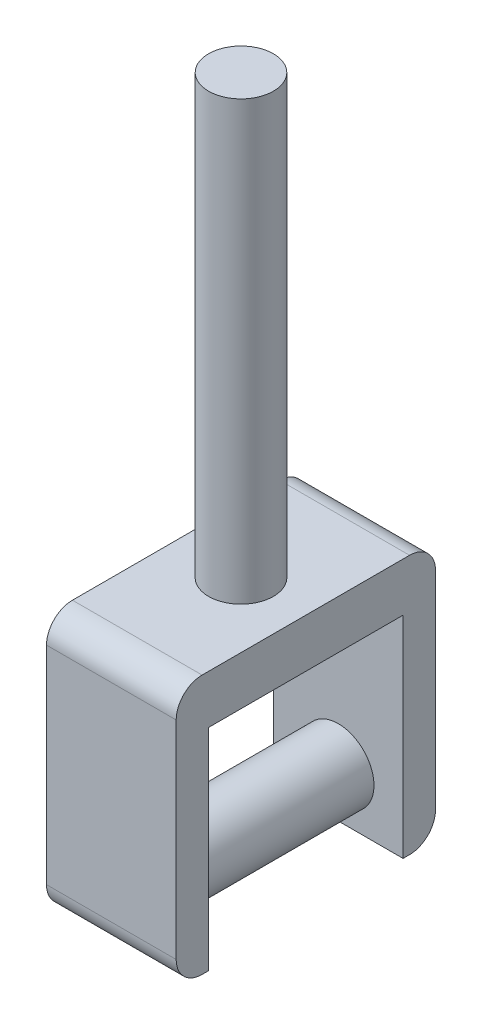
ISO-10303-21;
HEADER;
FILE_DESCRIPTION(('STEP AP214'),'2;1');
FILE_NAME('part.step','',(''),(''),'','','');
FILE_SCHEMA(('AUTOMOTIVE_DESIGN { 1 0 10303 214 1 1 1 1 }'));
ENDSEC;
DATA;
#1=APPLICATION_CONTEXT('core data for automotive mechanical design processes');
#2=APPLICATION_PROTOCOL_DEFINITION('international standard','automotive_design',2000,#1);
#3=PRODUCT_CONTEXT('',#1,'mechanical');
#4=PRODUCT('Part','Part','',(#3));
#5=PRODUCT_RELATED_PRODUCT_CATEGORY('part','',(#4));
#6=PRODUCT_DEFINITION_FORMATION('','',#4);
#7=PRODUCT_DEFINITION_CONTEXT('part definition',#1,'design');
#8=PRODUCT_DEFINITION('design','',#6,#7);
#9=PRODUCT_DEFINITION_SHAPE('','',#8);
#10=(LENGTH_UNIT() NAMED_UNIT(*) SI_UNIT(.MILLI.,.METRE.));
#11=(NAMED_UNIT(*) PLANE_ANGLE_UNIT() SI_UNIT($,.RADIAN.));
#12=(NAMED_UNIT(*) SI_UNIT($,.STERADIAN.) SOLID_ANGLE_UNIT());
#13=UNCERTAINTY_MEASURE_WITH_UNIT(LENGTH_MEASURE(1.E-05),#10,'distance_accuracy_value','');
#14=(GEOMETRIC_REPRESENTATION_CONTEXT(3) GLOBAL_UNCERTAINTY_ASSIGNED_CONTEXT((#13)) GLOBAL_UNIT_ASSIGNED_CONTEXT((#10,
#11,#12)) REPRESENTATION_CONTEXT('',''));
#15=CARTESIAN_POINT('',(0.,0.,0.));
#16=DIRECTION('',(0.,0.,1.));
#17=DIRECTION('',(1.,0.,0.));
#18=AXIS2_PLACEMENT_3D('',#15,#16,#17);
#19=CARTESIAN_POINT('',(0.,150.,0.));
#20=DIRECTION('',(0.,-1.,0.));
#21=DIRECTION('',(0.,0.,-1.));
#22=AXIS2_PLACEMENT_3D('',#19,#20,#21);
#23=CYLINDRICAL_SURFACE('',#22,10.);
#24=CARTESIAN_POINT('',(0.,15.,0.));
#25=DIRECTION('',(0.,1.,0.));
#26=DIRECTION('',(0.,0.,1.));
#27=AXIS2_PLACEMENT_3D('',#24,#25,#26);
#28=CIRCLE('',#27,10.);
#29=CARTESIAN_POINT('',(0.,15.,10.));
#30=VERTEX_POINT('',#29);
#31=EDGE_CURVE('E40',#30,#30,#28,.T.);
#32=ORIENTED_EDGE('',*,*,#31,.T.);
#33=EDGE_LOOP('',(#32));
#34=FACE_BOUND('',#33,.T.);
#35=CARTESIAN_POINT('',(0.,150.,0.));
#36=DIRECTION('',(0.,1.,0.));
#37=DIRECTION('',(0.,0.,1.));
#38=AXIS2_PLACEMENT_3D('',#35,#36,#37);
#39=CIRCLE('',#38,10.);
#40=CARTESIAN_POINT('',(0.,150.,10.));
#41=VERTEX_POINT('',#40);
#42=EDGE_CURVE('E11',#41,#41,#39,.T.);
#43=ORIENTED_EDGE('',*,*,#42,.F.);
#44=EDGE_LOOP('',(#43));
#45=FACE_BOUND('',#44,.T.);
#46=ADVANCED_FACE('F37',(#34,#45),#23,.T.);
#47=CARTESIAN_POINT('',(0.,150.,0.));
#48=DIRECTION('',(0.,1.,0.));
#49=DIRECTION('',(0.,0.,1.));
#50=AXIS2_PLACEMENT_3D('',#47,#48,#49);
#51=PLANE('',#50);
#52=ORIENTED_EDGE('',*,*,#42,.T.);
#53=EDGE_LOOP('',(#52));
#54=FACE_BOUND('',#53,.T.);
#55=ADVANCED_FACE('F274',(#54),#51,.T.);
#56=CARTESIAN_POINT('',(-20.,-65.,31.9999999999999));
#57=DIRECTION('',(0.,-1.,0.));
#58=DIRECTION('',(0.,0.,-1.));
#59=AXIS2_PLACEMENT_3D('',#56,#57,#58);
#60=PLANE('',#59);
#61=DIRECTION('',(1.,0.,0.));
#62=VECTOR('',#61,1.);
#63=CARTESIAN_POINT('',(-20.,-65.,30.));
#64=LINE('',#63,#62);
#65=CARTESIAN_POINT('',(-20.,-65.,30.));
#66=VERTEX_POINT('',#65);
#67=CARTESIAN_POINT('',(20.,-65.,30.));
#68=VERTEX_POINT('',#67);
#69=EDGE_CURVE('E124',#66,#68,#64,.T.);
#70=ORIENTED_EDGE('',*,*,#69,.T.);
#71=DIRECTION('',(0.,0.,-1.));
#72=VECTOR('',#71,1.);
#73=CARTESIAN_POINT('',(20.,-65.,31.9999999999999));
#74=LINE('',#73,#72);
#75=CARTESIAN_POINT('',(20.,-65.,31.9999999999999));
#76=VERTEX_POINT('',#75);
#77=EDGE_CURVE('E128',#76,#68,#74,.T.);
#78=ORIENTED_EDGE('',*,*,#77,.F.);
#79=DIRECTION('',(1.,0.,0.));
#80=VECTOR('',#79,1.);
#81=CARTESIAN_POINT('',(-20.,-65.,31.9999999999999));
#82=LINE('',#81,#80);
#83=CARTESIAN_POINT('',(-20.,-65.,31.9999999999999));
#84=VERTEX_POINT('',#83);
#85=EDGE_CURVE('E51',#84,#76,#82,.T.);
#86=ORIENTED_EDGE('',*,*,#85,.F.);
#87=DIRECTION('',(0.,0.,-1.));
#88=VECTOR('',#87,1.);
#89=CARTESIAN_POINT('',(-20.,-65.,31.9999999999999));
#90=LINE('',#89,#88);
#91=EDGE_CURVE('E129',#84,#66,#90,.T.);
#92=ORIENTED_EDGE('',*,*,#91,.T.);
#93=EDGE_LOOP('',(#70,#78,#86,#92));
#94=FACE_BOUND('',#93,.T.);
#95=ADVANCED_FACE('F126',(#94),#60,.T.);
#96=CARTESIAN_POINT('',(-20.,-57.,32.));
#97=DIRECTION('',(1.,0.,0.));
#98=DIRECTION('',(0.,0.,-1.));
#99=AXIS2_PLACEMENT_3D('',#96,#97,#98);
#100=CYLINDRICAL_SURFACE('',#99,8.);
#101=ORIENTED_EDGE('',*,*,#85,.T.);
#102=CARTESIAN_POINT('',(20.,-57.,32.));
#103=DIRECTION('',(1.,0.,0.));
#104=DIRECTION('',(0.,0.,1.));
#105=AXIS2_PLACEMENT_3D('',#102,#103,#104);
#106=CIRCLE('',#105,8.);
#107=CARTESIAN_POINT('',(20.,-56.9999999999999,40.));
#108=VERTEX_POINT('',#107);
#109=EDGE_CURVE('E147',#108,#76,#106,.T.);
#110=ORIENTED_EDGE('',*,*,#109,.F.);
#111=DIRECTION('',(1.,0.,0.));
#112=VECTOR('',#111,1.);
#113=CARTESIAN_POINT('',(-20.,-56.9999999999999,40.));
#114=LINE('',#113,#112);
#115=CARTESIAN_POINT('',(-20.,-56.9999999999999,40.));
#116=VERTEX_POINT('',#115);
#117=EDGE_CURVE('E59',#116,#108,#114,.T.);
#118=ORIENTED_EDGE('',*,*,#117,.F.);
#119=CARTESIAN_POINT('',(-20.,-57.,32.));
#120=DIRECTION('',(1.,0.,0.));
#121=DIRECTION('',(0.,0.,1.));
#122=AXIS2_PLACEMENT_3D('',#119,#120,#121);
#123=CIRCLE('',#122,8.);
#124=EDGE_CURVE('E134',#116,#84,#123,.T.);
#125=ORIENTED_EDGE('',*,*,#124,.T.);
#126=EDGE_LOOP('',(#101,#110,#118,#125));
#127=FACE_BOUND('',#126,.T.);
#128=ADVANCED_FACE('F266',(#127),#100,.T.);
#129=CARTESIAN_POINT('',(-20.,6.99999999999994,40.));
#130=DIRECTION('',(0.,0.,1.));
#131=DIRECTION('',(0.,-1.,0.));
#132=AXIS2_PLACEMENT_3D('',#129,#130,#131);
#133=PLANE('',#132);
#134=ORIENTED_EDGE('',*,*,#117,.T.);
#135=DIRECTION('',(0.,-1.,0.));
#136=VECTOR('',#135,1.);
#137=CARTESIAN_POINT('',(20.,6.99999999999994,40.));
#138=LINE('',#137,#136);
#139=CARTESIAN_POINT('',(20.,6.99999999999994,40.));
#140=VERTEX_POINT('',#139);
#141=EDGE_CURVE('E177',#140,#108,#138,.T.);
#142=ORIENTED_EDGE('',*,*,#141,.F.);
#143=DIRECTION('',(1.,0.,0.));
#144=VECTOR('',#143,1.);
#145=CARTESIAN_POINT('',(-20.,6.99999999999994,40.));
#146=LINE('',#145,#144);
#147=CARTESIAN_POINT('',(-20.,6.99999999999994,40.));
#148=VERTEX_POINT('',#147);
#149=EDGE_CURVE('E212',#148,#140,#146,.T.);
#150=ORIENTED_EDGE('',*,*,#149,.F.);
#151=DIRECTION('',(0.,-1.,0.));
#152=VECTOR('',#151,1.);
#153=CARTESIAN_POINT('',(-20.,6.99999999999994,40.));
#154=LINE('',#153,#152);
#155=EDGE_CURVE('E207',#148,#116,#154,.T.);
#156=ORIENTED_EDGE('',*,*,#155,.T.);
#157=EDGE_LOOP('',(#134,#142,#150,#156));
#158=FACE_BOUND('',#157,.T.);
#159=ADVANCED_FACE('F264',(#158),#133,.T.);
#160=CARTESIAN_POINT('',(-20.,7.,32.));
#161=DIRECTION('',(1.,0.,0.));
#162=DIRECTION('',(0.,0.,-1.));
#163=AXIS2_PLACEMENT_3D('',#160,#161,#162);
#164=CYLINDRICAL_SURFACE('',#163,8.);
#165=ORIENTED_EDGE('',*,*,#149,.T.);
#166=CARTESIAN_POINT('',(20.,7.,32.));
#167=DIRECTION('',(1.,0.,0.));
#168=DIRECTION('',(0.,0.,1.));
#169=AXIS2_PLACEMENT_3D('',#166,#167,#168);
#170=CIRCLE('',#169,8.);
#171=CARTESIAN_POINT('',(20.,15.,31.9999999999999));
#172=VERTEX_POINT('',#171);
#173=EDGE_CURVE('E174',#172,#140,#170,.T.);
#174=ORIENTED_EDGE('',*,*,#173,.F.);
#175=DIRECTION('',(1.,0.,0.));
#176=VECTOR('',#175,1.);
#177=CARTESIAN_POINT('',(-20.,15.,31.9999999999999));
#178=LINE('',#177,#176);
#179=CARTESIAN_POINT('',(-20.,15.,31.9999999999999));
#180=VERTEX_POINT('',#179);
#181=EDGE_CURVE('E214',#180,#172,#178,.T.);
#182=ORIENTED_EDGE('',*,*,#181,.F.);
#183=CARTESIAN_POINT('',(-20.,7.,32.));
#184=DIRECTION('',(1.,0.,0.));
#185=DIRECTION('',(0.,0.,1.));
#186=AXIS2_PLACEMENT_3D('',#183,#184,#185);
#187=CIRCLE('',#186,8.);
#188=EDGE_CURVE('E204',#180,#148,#187,.T.);
#189=ORIENTED_EDGE('',*,*,#188,.T.);
#190=EDGE_LOOP('',(#165,#174,#182,#189));
#191=FACE_BOUND('',#190,.T.);
#192=ADVANCED_FACE('F262',(#191),#164,.T.);
#193=CARTESIAN_POINT('',(-20.,15.,31.9999999999999));
#194=DIRECTION('',(0.,1.,0.));
#195=DIRECTION('',(0.,0.,1.));
#196=AXIS2_PLACEMENT_3D('',#193,#194,#195);
#197=PLANE('',#196);
#198=ORIENTED_EDGE('',*,*,#31,.F.);
#199=EDGE_LOOP('',(#198));
#200=FACE_BOUND('',#199,.T.);
#201=ORIENTED_EDGE('',*,*,#181,.T.);
#202=DIRECTION('',(0.,0.,1.));
#203=VECTOR('',#202,1.);
#204=CARTESIAN_POINT('',(20.,15.,31.9999999999999));
#205=LINE('',#204,#203);
#206=CARTESIAN_POINT('',(20.,15.,-31.9999999999999));
#207=VERTEX_POINT('',#206);
#208=EDGE_CURVE('E171',#207,#172,#205,.T.);
#209=ORIENTED_EDGE('',*,*,#208,.F.);
#210=DIRECTION('',(1.,0.,0.));
#211=VECTOR('',#210,1.);
#212=CARTESIAN_POINT('',(-20.,15.,-31.9999999999999));
#213=LINE('',#212,#211);
#214=CARTESIAN_POINT('',(-20.,15.,-31.9999999999999));
#215=VERTEX_POINT('',#214);
#216=EDGE_CURVE('E216',#215,#207,#213,.T.);
#217=ORIENTED_EDGE('',*,*,#216,.F.);
#218=DIRECTION('',(0.,0.,1.));
#219=VECTOR('',#218,1.);
#220=CARTESIAN_POINT('',(-20.,15.,31.9999999999999));
#221=LINE('',#220,#219);
#222=EDGE_CURVE('E201',#215,#180,#221,.T.);
#223=ORIENTED_EDGE('',*,*,#222,.T.);
#224=EDGE_LOOP('',(#201,#209,#217,#223));
#225=FACE_BOUND('',#224,.T.);
#226=ADVANCED_FACE('F257',(#200,#225),#197,.T.);
#227=CARTESIAN_POINT('',(-20.,7.,-32.));
#228=DIRECTION('',(1.,0.,0.));
#229=DIRECTION('',(0.,0.,-1.));
#230=AXIS2_PLACEMENT_3D('',#227,#228,#229);
#231=CYLINDRICAL_SURFACE('',#230,8.);
#232=ORIENTED_EDGE('',*,*,#216,.T.);
#233=CARTESIAN_POINT('',(20.,7.,-32.));
#234=DIRECTION('',(1.,0.,0.));
#235=DIRECTION('',(0.,0.,-1.));
#236=AXIS2_PLACEMENT_3D('',#233,#234,#235);
#237=CIRCLE('',#236,8.);
#238=CARTESIAN_POINT('',(20.,6.99999999999994,-40.));
#239=VERTEX_POINT('',#238);
#240=EDGE_CURVE('E168',#239,#207,#237,.T.);
#241=ORIENTED_EDGE('',*,*,#240,.F.);
#242=DIRECTION('',(1.,0.,0.));
#243=VECTOR('',#242,1.);
#244=CARTESIAN_POINT('',(-20.,6.99999999999994,-40.));
#245=LINE('',#244,#243);
#246=CARTESIAN_POINT('',(-20.,6.99999999999994,-40.));
#247=VERTEX_POINT('',#246);
#248=EDGE_CURVE('E218',#247,#239,#245,.T.);
#249=ORIENTED_EDGE('',*,*,#248,.F.);
#250=CARTESIAN_POINT('',(-20.,7.,-32.));
#251=DIRECTION('',(1.,0.,0.));
#252=DIRECTION('',(0.,0.,-1.));
#253=AXIS2_PLACEMENT_3D('',#250,#251,#252);
#254=CIRCLE('',#253,8.);
#255=EDGE_CURVE('E198',#247,#215,#254,.T.);
#256=ORIENTED_EDGE('',*,*,#255,.T.);
#257=EDGE_LOOP('',(#232,#241,#249,#256));
#258=FACE_BOUND('',#257,.T.);
#259=ADVANCED_FACE('F252',(#258),#231,.T.);
#260=CARTESIAN_POINT('',(-20.,6.99999999999994,-40.));
#261=DIRECTION('',(0.,0.,-1.));
#262=DIRECTION('',(0.,1.,0.));
#263=AXIS2_PLACEMENT_3D('',#260,#261,#262);
#264=PLANE('',#263);
#265=ORIENTED_EDGE('',*,*,#248,.T.);
#266=DIRECTION('',(0.,1.,0.));
#267=VECTOR('',#266,1.);
#268=CARTESIAN_POINT('',(20.,6.99999999999994,-40.));
#269=LINE('',#268,#267);
#270=CARTESIAN_POINT('',(20.,-56.9999999999999,-40.));
#271=VERTEX_POINT('',#270);
#272=EDGE_CURVE('E165',#271,#239,#269,.T.);
#273=ORIENTED_EDGE('',*,*,#272,.F.);
#274=DIRECTION('',(1.,0.,0.));
#275=VECTOR('',#274,1.);
#276=CARTESIAN_POINT('',(-20.,-56.9999999999999,-40.));
#277=LINE('',#276,#275);
#278=CARTESIAN_POINT('',(-20.,-56.9999999999999,-40.));
#279=VERTEX_POINT('',#278);
#280=EDGE_CURVE('E220',#279,#271,#277,.T.);
#281=ORIENTED_EDGE('',*,*,#280,.F.);
#282=DIRECTION('',(0.,1.,0.));
#283=VECTOR('',#282,1.);
#284=CARTESIAN_POINT('',(-20.,6.99999999999994,-40.));
#285=LINE('',#284,#283);
#286=EDGE_CURVE('E195',#279,#247,#285,.T.);
#287=ORIENTED_EDGE('',*,*,#286,.T.);
#288=EDGE_LOOP('',(#265,#273,#281,#287));
#289=FACE_BOUND('',#288,.T.);
#290=ADVANCED_FACE('F250',(#289),#264,.T.);
#291=CARTESIAN_POINT('',(-20.,-57.,-32.));
#292=DIRECTION('',(1.,0.,0.));
#293=DIRECTION('',(0.,0.,-1.));
#294=AXIS2_PLACEMENT_3D('',#291,#292,#293);
#295=CYLINDRICAL_SURFACE('',#294,8.);
#296=ORIENTED_EDGE('',*,*,#280,.T.);
#297=CARTESIAN_POINT('',(20.,-57.,-32.));
#298=DIRECTION('',(1.,0.,0.));
#299=DIRECTION('',(0.,0.,1.));
#300=AXIS2_PLACEMENT_3D('',#297,#298,#299);
#301=CIRCLE('',#300,8.);
#302=CARTESIAN_POINT('',(20.,-65.,-32.));
#303=VERTEX_POINT('',#302);
#304=EDGE_CURVE('E162',#303,#271,#301,.T.);
#305=ORIENTED_EDGE('',*,*,#304,.F.);
#306=DIRECTION('',(1.,0.,0.));
#307=VECTOR('',#306,1.);
#308=CARTESIAN_POINT('',(-20.,-65.,-32.));
#309=LINE('',#308,#307);
#310=CARTESIAN_POINT('',(-20.,-65.,-32.));
#311=VERTEX_POINT('',#310);
#312=EDGE_CURVE('E222',#311,#303,#309,.T.);
#313=ORIENTED_EDGE('',*,*,#312,.F.);
#314=CARTESIAN_POINT('',(-20.,-57.,-32.));
#315=DIRECTION('',(1.,0.,0.));
#316=DIRECTION('',(0.,0.,1.));
#317=AXIS2_PLACEMENT_3D('',#314,#315,#316);
#318=CIRCLE('',#317,8.);
#319=EDGE_CURVE('E192',#311,#279,#318,.T.);
#320=ORIENTED_EDGE('',*,*,#319,.T.);
#321=EDGE_LOOP('',(#296,#305,#313,#320));
#322=FACE_BOUND('',#321,.T.);
#323=ADVANCED_FACE('F245',(#322),#295,.T.);
#324=CARTESIAN_POINT('',(-20.,-65.,-30.));
#325=DIRECTION('',(0.,-1.,0.));
#326=DIRECTION('',(0.,0.,-1.));
#327=AXIS2_PLACEMENT_3D('',#324,#325,#326);
#328=PLANE('',#327);
#329=ORIENTED_EDGE('',*,*,#312,.T.);
#330=DIRECTION('',(0.,0.,-1.));
#331=VECTOR('',#330,1.);
#332=CARTESIAN_POINT('',(20.,-65.,-30.));
#333=LINE('',#332,#331);
#334=CARTESIAN_POINT('',(20.,-65.,-30.));
#335=VERTEX_POINT('',#334);
#336=EDGE_CURVE('E159',#335,#303,#333,.T.);
#337=ORIENTED_EDGE('',*,*,#336,.F.);
#338=DIRECTION('',(1.,0.,0.));
#339=VECTOR('',#338,1.);
#340=CARTESIAN_POINT('',(-20.,-65.,-30.));
#341=LINE('',#340,#339);
#342=CARTESIAN_POINT('',(-20.,-65.,-30.));
#343=VERTEX_POINT('',#342);
#344=EDGE_CURVE('E224',#343,#335,#341,.T.);
#345=ORIENTED_EDGE('',*,*,#344,.F.);
#346=DIRECTION('',(0.,0.,-1.));
#347=VECTOR('',#346,1.);
#348=CARTESIAN_POINT('',(-20.,-65.,-30.));
#349=LINE('',#348,#347);
#350=EDGE_CURVE('E189',#343,#311,#349,.T.);
#351=ORIENTED_EDGE('',*,*,#350,.T.);
#352=EDGE_LOOP('',(#329,#337,#345,#351));
#353=FACE_BOUND('',#352,.T.);
#354=ADVANCED_FACE('F238',(#353),#328,.T.);
#355=CARTESIAN_POINT('',(-20.,0.,-30.));
#356=DIRECTION('',(0.,0.,1.));
#357=DIRECTION('',(0.,-1.,0.));
#358=AXIS2_PLACEMENT_3D('',#355,#356,#357);
#359=PLANE('',#358);
#360=CARTESIAN_POINT('',(0.,-50.,-30.));
#361=DIRECTION('',(0.,0.,1.));
#362=DIRECTION('',(1.,0.,0.));
#363=AXIS2_PLACEMENT_3D('',#360,#361,#362);
#364=CIRCLE('',#363,11.0248085037374);
#365=CARTESIAN_POINT('',(11.0248085037374,-50.,-30.));
#366=VERTEX_POINT('',#365);
#367=EDGE_CURVE('E148',#366,#366,#364,.T.);
#368=ORIENTED_EDGE('',*,*,#367,.F.);
#369=EDGE_LOOP('',(#368));
#370=FACE_BOUND('',#369,.T.);
#371=ORIENTED_EDGE('',*,*,#344,.T.);
#372=DIRECTION('',(0.,-1.,0.));
#373=VECTOR('',#372,1.);
#374=CARTESIAN_POINT('',(20.,0.,-30.));
#375=LINE('',#374,#373);
#376=CARTESIAN_POINT('',(20.,0.,-30.));
#377=VERTEX_POINT('',#376);
#378=EDGE_CURVE('E156',#377,#335,#375,.T.);
#379=ORIENTED_EDGE('',*,*,#378,.F.);
#380=DIRECTION('',(1.,0.,0.));
#381=VECTOR('',#380,1.);
#382=CARTESIAN_POINT('',(-20.,0.,-30.));
#383=LINE('',#382,#381);
#384=CARTESIAN_POINT('',(-20.,0.,-30.));
#385=VERTEX_POINT('',#384);
#386=EDGE_CURVE('E226',#385,#377,#383,.T.);
#387=ORIENTED_EDGE('',*,*,#386,.F.);
#388=DIRECTION('',(0.,-1.,0.));
#389=VECTOR('',#388,1.);
#390=CARTESIAN_POINT('',(-20.,0.,-30.));
#391=LINE('',#390,#389);
#392=EDGE_CURVE('E186',#385,#343,#391,.T.);
#393=ORIENTED_EDGE('',*,*,#392,.T.);
#394=EDGE_LOOP('',(#371,#379,#387,#393));
#395=FACE_BOUND('',#394,.T.);
#396=ADVANCED_FACE('F235',(#370,#395),#359,.T.);
#397=CARTESIAN_POINT('',(-20.,-65.,30.));
#398=DIRECTION('',(0.,0.,-1.));
#399=DIRECTION('',(-1.,0.,0.));
#400=AXIS2_PLACEMENT_3D('',#397,#398,#399);
#401=PLANE('',#400);
#402=CARTESIAN_POINT('',(0.,-50.,30.));
#403=DIRECTION('',(0.,0.,-1.));
#404=DIRECTION('',(-1.,0.,0.));
#405=AXIS2_PLACEMENT_3D('',#402,#403,#404);
#406=CIRCLE('',#405,11.0248085037374);
#407=CARTESIAN_POINT('',(-11.0248085037374,-50.,30.));
#408=VERTEX_POINT('',#407);
#409=EDGE_CURVE('E151',#408,#408,#406,.T.);
#410=ORIENTED_EDGE('',*,*,#409,.F.);
#411=EDGE_LOOP('',(#410));
#412=FACE_BOUND('',#411,.T.);
#413=DIRECTION('',(1.,0.,0.));
#414=VECTOR('',#413,1.);
#415=CARTESIAN_POINT('',(-20.,0.,30.));
#416=LINE('',#415,#414);
#417=CARTESIAN_POINT('',(-20.,0.,30.));
#418=VERTEX_POINT('',#417);
#419=CARTESIAN_POINT('',(20.,0.,30.));
#420=VERTEX_POINT('',#419);
#421=EDGE_CURVE('E133',#418,#420,#416,.T.);
#422=ORIENTED_EDGE('',*,*,#421,.T.);
#423=DIRECTION('',(0.,1.,0.));
#424=VECTOR('',#423,1.);
#425=CARTESIAN_POINT('',(20.,-65.,30.));
#426=LINE('',#425,#424);
#427=EDGE_CURVE('E137',#68,#420,#426,.T.);
#428=ORIENTED_EDGE('',*,*,#427,.F.);
#429=ORIENTED_EDGE('',*,*,#69,.F.);
#430=DIRECTION('',(0.,1.,0.));
#431=VECTOR('',#430,1.);
#432=CARTESIAN_POINT('',(-20.,-65.,30.));
#433=LINE('',#432,#431);
#434=EDGE_CURVE('E181',#66,#418,#433,.T.);
#435=ORIENTED_EDGE('',*,*,#434,.T.);
#436=EDGE_LOOP('',(#422,#428,#429,#435));
#437=FACE_BOUND('',#436,.T.);
#438=ADVANCED_FACE('F138',(#412,#437),#401,.T.);
#439=CARTESIAN_POINT('',(-20.,-57.,-32.));
#440=DIRECTION('',(-1.,0.,0.));
#441=DIRECTION('',(0.,0.,1.));
#442=AXIS2_PLACEMENT_3D('',#439,#440,#441);
#443=PLANE('',#442);
#444=ORIENTED_EDGE('',*,*,#91,.F.);
#445=ORIENTED_EDGE('',*,*,#124,.F.);
#446=ORIENTED_EDGE('',*,*,#155,.F.);
#447=ORIENTED_EDGE('',*,*,#188,.F.);
#448=ORIENTED_EDGE('',*,*,#222,.F.);
#449=ORIENTED_EDGE('',*,*,#255,.F.);
#450=ORIENTED_EDGE('',*,*,#286,.F.);
#451=ORIENTED_EDGE('',*,*,#319,.F.);
#452=ORIENTED_EDGE('',*,*,#350,.F.);
#453=ORIENTED_EDGE('',*,*,#392,.F.);
#454=DIRECTION('',(0.,0.,-1.));
#455=VECTOR('',#454,1.);
#456=CARTESIAN_POINT('',(-20.,0.,30.));
#457=LINE('',#456,#455);
#458=EDGE_CURVE('E183',#418,#385,#457,.T.);
#459=ORIENTED_EDGE('',*,*,#458,.F.);
#460=ORIENTED_EDGE('',*,*,#434,.F.);
#461=EDGE_LOOP('',(#444,#445,#446,#447,#448,#449,#450,#451,#452,#453,#459,#460));
#462=FACE_BOUND('',#461,.T.);
#463=ADVANCED_FACE('F241',(#462),#443,.T.);
#464=CARTESIAN_POINT('',(20.,-57.,-32.));
#465=DIRECTION('',(-1.,0.,0.));
#466=DIRECTION('',(0.,0.,1.));
#467=AXIS2_PLACEMENT_3D('',#464,#465,#466);
#468=PLANE('',#467);
#469=ORIENTED_EDGE('',*,*,#77,.T.);
#470=ORIENTED_EDGE('',*,*,#427,.T.);
#471=DIRECTION('',(0.,0.,-1.));
#472=VECTOR('',#471,1.);
#473=CARTESIAN_POINT('',(20.,0.,30.));
#474=LINE('',#473,#472);
#475=EDGE_CURVE('E142',#420,#377,#474,.T.);
#476=ORIENTED_EDGE('',*,*,#475,.T.);
#477=ORIENTED_EDGE('',*,*,#378,.T.);
#478=ORIENTED_EDGE('',*,*,#336,.T.);
#479=ORIENTED_EDGE('',*,*,#304,.T.);
#480=ORIENTED_EDGE('',*,*,#272,.T.);
#481=ORIENTED_EDGE('',*,*,#240,.T.);
#482=ORIENTED_EDGE('',*,*,#208,.T.);
#483=ORIENTED_EDGE('',*,*,#173,.T.);
#484=ORIENTED_EDGE('',*,*,#141,.T.);
#485=ORIENTED_EDGE('',*,*,#109,.T.);
#486=EDGE_LOOP('',(#469,#470,#476,#477,#478,#479,#480,#481,#482,#483,#484,#485));
#487=FACE_BOUND('',#486,.T.);
#488=ADVANCED_FACE('F145',(#487),#468,.F.);
#489=CARTESIAN_POINT('',(0.,0.,0.));
#490=DIRECTION('',(0.,1.,0.));
#491=DIRECTION('',(0.,0.,1.));
#492=AXIS2_PLACEMENT_3D('',#489,#490,#491);
#493=PLANE('',#492);
#494=ORIENTED_EDGE('',*,*,#386,.T.);
#495=ORIENTED_EDGE('',*,*,#475,.F.);
#496=ORIENTED_EDGE('',*,*,#421,.F.);
#497=ORIENTED_EDGE('',*,*,#458,.T.);
#498=EDGE_LOOP('',(#494,#495,#496,#497));
#499=FACE_BOUND('',#498,.T.);
#500=ADVANCED_FACE('F229',(#499),#493,.F.);
#501=CARTESIAN_POINT('',(0.,-50.,40.002));
#502=DIRECTION('',(0.,0.,-1.));
#503=DIRECTION('',(-1.,0.,0.));
#504=AXIS2_PLACEMENT_3D('',#501,#502,#503);
#505=CYLINDRICAL_SURFACE('',#504,11.0248085037374);
#506=ORIENTED_EDGE('',*,*,#409,.T.);
#507=EDGE_LOOP('',(#506));
#508=FACE_BOUND('',#507,.T.);
#509=ORIENTED_EDGE('',*,*,#367,.T.);
#510=EDGE_LOOP('',(#509));
#511=FACE_BOUND('',#510,.T.);
#512=ADVANCED_FACE('F310',(#508,#511),#505,.T.);
#513=CLOSED_SHELL('',(#46,#55,#95,#128,#159,#192,#226,#259,#290,#323,#354,#396,#438,#463,#488,
#500,#512));
#514=MANIFOLD_SOLID_BREP('B2',#513);
#515=ADVANCED_BREP_SHAPE_REPRESENTATION('',(#18,#514),#14);
#516=SHAPE_DEFINITION_REPRESENTATION(#9,#515);
ENDSEC;
END-ISO-10303-21;
